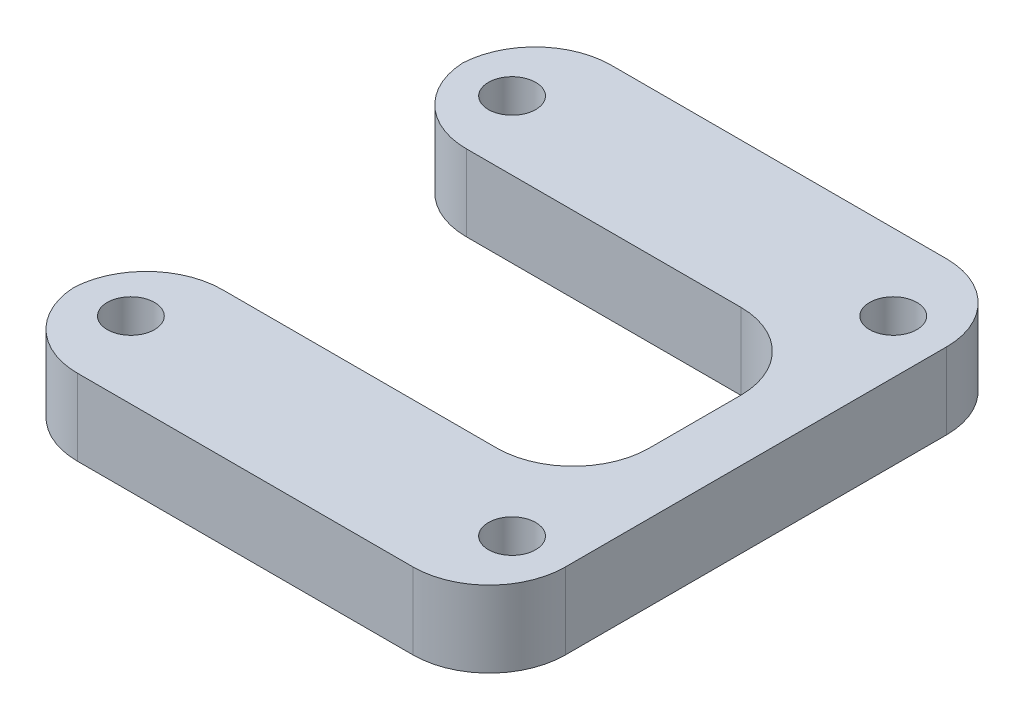
ISO-10303-21;
HEADER;
FILE_DESCRIPTION(('STEP AP214'),'2;1');
FILE_NAME('part.step','',(''),(''),'','','');
FILE_SCHEMA(('AUTOMOTIVE_DESIGN { 1 0 10303 214 1 1 1 1 }'));
ENDSEC;
DATA;
#1=APPLICATION_CONTEXT('core data for automotive mechanical design processes');
#2=APPLICATION_PROTOCOL_DEFINITION('international standard','automotive_design',2000,#1);
#3=PRODUCT_CONTEXT('',#1,'mechanical');
#4=PRODUCT('Part','Part','',(#3));
#5=PRODUCT_RELATED_PRODUCT_CATEGORY('part','',(#4));
#6=PRODUCT_DEFINITION_FORMATION('','',#4);
#7=PRODUCT_DEFINITION_CONTEXT('part definition',#1,'design');
#8=PRODUCT_DEFINITION('design','',#6,#7);
#9=PRODUCT_DEFINITION_SHAPE('','',#8);
#10=(LENGTH_UNIT() NAMED_UNIT(*) SI_UNIT(.MILLI.,.METRE.));
#11=(NAMED_UNIT(*) PLANE_ANGLE_UNIT() SI_UNIT($,.RADIAN.));
#12=(NAMED_UNIT(*) SI_UNIT($,.STERADIAN.) SOLID_ANGLE_UNIT());
#13=UNCERTAINTY_MEASURE_WITH_UNIT(LENGTH_MEASURE(1.E-05),#10,'distance_accuracy_value','');
#14=(GEOMETRIC_REPRESENTATION_CONTEXT(3) GLOBAL_UNCERTAINTY_ASSIGNED_CONTEXT((#13)) GLOBAL_UNIT_ASSIGNED_CONTEXT((#10,
#11,#12)) REPRESENTATION_CONTEXT('',''));
#15=CARTESIAN_POINT('',(0.,0.,0.));
#16=DIRECTION('',(0.,0.,1.));
#17=DIRECTION('',(1.,0.,0.));
#18=AXIS2_PLACEMENT_3D('',#15,#16,#17);
#19=CARTESIAN_POINT('',(0.,5.,-8.));
#20=DIRECTION('',(0.,0.,1.));
#21=DIRECTION('',(1.,0.,0.));
#22=AXIS2_PLACEMENT_3D('',#19,#20,#21);
#23=PLANE('',#22);
#24=DIRECTION('',(-1.,0.,0.));
#25=VECTOR('',#24,1.);
#26=CARTESIAN_POINT('',(0.,0.,-8.));
#27=LINE('',#26,#25);
#28=CARTESIAN_POINT('',(7.,0.,-8.00000000000001));
#29=VERTEX_POINT('',#28);
#30=CARTESIAN_POINT('',(-11.,0.,-8.));
#31=VERTEX_POINT('',#30);
#32=EDGE_CURVE('E145',#29,#31,#27,.T.);
#33=ORIENTED_EDGE('',*,*,#32,.F.);
#34=DIRECTION('',(0.,-1.,0.));
#35=VECTOR('',#34,1.);
#36=CARTESIAN_POINT('',(7.,5.,-8.));
#37=LINE('',#36,#35);
#38=CARTESIAN_POINT('',(7.,5.,-8.00000000000001));
#39=VERTEX_POINT('',#38);
#40=EDGE_CURVE('E158',#29,#39,#37,.F.);
#41=ORIENTED_EDGE('',*,*,#40,.T.);
#42=DIRECTION('',(-1.,0.,0.));
#43=VECTOR('',#42,1.);
#44=CARTESIAN_POINT('',(0.,5.,-8.));
#45=LINE('',#44,#43);
#46=CARTESIAN_POINT('',(-11.,5.,-8.));
#47=VERTEX_POINT('',#46);
#48=EDGE_CURVE('E255',#39,#47,#45,.T.);
#49=ORIENTED_EDGE('',*,*,#48,.T.);
#50=DIRECTION('',(0.,-1.,0.));
#51=VECTOR('',#50,1.);
#52=CARTESIAN_POINT('',(-11.,0.,-8.));
#53=LINE('',#52,#51);
#54=EDGE_CURVE('E161',#47,#31,#53,.T.);
#55=ORIENTED_EDGE('',*,*,#54,.T.);
#56=EDGE_LOOP('',(#33,#41,#49,#55));
#57=FACE_BOUND('',#56,.T.);
#58=ADVANCED_FACE('F41',(#57),#23,.T.);
#59=CARTESIAN_POINT('',(12.,5.,0.));
#60=DIRECTION('',(-1.,0.,0.));
#61=DIRECTION('',(0.,0.,1.));
#62=AXIS2_PLACEMENT_3D('',#59,#60,#61);
#63=PLANE('',#62);
#64=DIRECTION('',(0.,0.,-1.));
#65=VECTOR('',#64,1.);
#66=CARTESIAN_POINT('',(12.,0.,0.));
#67=LINE('',#66,#65);
#68=CARTESIAN_POINT('',(12.,0.,3.));
#69=VERTEX_POINT('',#68);
#70=CARTESIAN_POINT('',(12.,0.,-3.));
#71=VERTEX_POINT('',#70);
#72=EDGE_CURVE('E148',#69,#71,#67,.T.);
#73=ORIENTED_EDGE('',*,*,#72,.F.);
#74=DIRECTION('',(0.,-1.,0.));
#75=VECTOR('',#74,1.);
#76=CARTESIAN_POINT('',(12.,5.,3.));
#77=LINE('',#76,#75);
#78=CARTESIAN_POINT('',(12.,5.,3.));
#79=VERTEX_POINT('',#78);
#80=EDGE_CURVE('E173',#69,#79,#77,.F.);
#81=ORIENTED_EDGE('',*,*,#80,.T.);
#82=DIRECTION('',(0.,0.,-1.));
#83=VECTOR('',#82,1.);
#84=CARTESIAN_POINT('',(12.,5.,0.));
#85=LINE('',#84,#83);
#86=CARTESIAN_POINT('',(12.,5.,-3.));
#87=VERTEX_POINT('',#86);
#88=EDGE_CURVE('E248',#79,#87,#85,.T.);
#89=ORIENTED_EDGE('',*,*,#88,.T.);
#90=DIRECTION('',(0.,-1.,0.));
#91=VECTOR('',#90,1.);
#92=CARTESIAN_POINT('',(12.,0.,-3.));
#93=LINE('',#92,#91);
#94=EDGE_CURVE('E240',#87,#71,#93,.T.);
#95=ORIENTED_EDGE('',*,*,#94,.T.);
#96=EDGE_LOOP('',(#73,#81,#89,#95));
#97=FACE_BOUND('',#96,.T.);
#98=ADVANCED_FACE('F247',(#97),#63,.T.);
#99=CARTESIAN_POINT('',(0.,5.,8.));
#100=DIRECTION('',(0.,0.,-1.));
#101=DIRECTION('',(-1.,0.,0.));
#102=AXIS2_PLACEMENT_3D('',#99,#100,#101);
#103=PLANE('',#102);
#104=DIRECTION('',(1.,0.,0.));
#105=VECTOR('',#104,1.);
#106=CARTESIAN_POINT('',(0.,0.,8.));
#107=LINE('',#106,#105);
#108=CARTESIAN_POINT('',(-11.,0.,8.));
#109=VERTEX_POINT('',#108);
#110=CARTESIAN_POINT('',(7.,0.,8.));
#111=VERTEX_POINT('',#110);
#112=EDGE_CURVE('E299',#109,#111,#107,.T.);
#113=ORIENTED_EDGE('',*,*,#112,.F.);
#114=DIRECTION('',(0.,-1.,0.));
#115=VECTOR('',#114,1.);
#116=CARTESIAN_POINT('',(-11.,5.,8.));
#117=LINE('',#116,#115);
#118=CARTESIAN_POINT('',(-11.,5.,8.));
#119=VERTEX_POINT('',#118);
#120=EDGE_CURVE('E209',#109,#119,#117,.F.);
#121=ORIENTED_EDGE('',*,*,#120,.T.);
#122=DIRECTION('',(1.,0.,0.));
#123=VECTOR('',#122,1.);
#124=CARTESIAN_POINT('',(0.,5.,8.));
#125=LINE('',#124,#123);
#126=CARTESIAN_POINT('',(7.,5.,8.));
#127=VERTEX_POINT('',#126);
#128=EDGE_CURVE('E254',#119,#127,#125,.T.);
#129=ORIENTED_EDGE('',*,*,#128,.T.);
#130=DIRECTION('',(0.,-1.,0.));
#131=VECTOR('',#130,1.);
#132=CARTESIAN_POINT('',(7.,0.,8.));
#133=LINE('',#132,#131);
#134=EDGE_CURVE('E260',#127,#111,#133,.T.);
#135=ORIENTED_EDGE('',*,*,#134,.T.);
#136=EDGE_LOOP('',(#113,#121,#129,#135));
#137=FACE_BOUND('',#136,.T.);
#138=ADVANCED_FACE('F381',(#137),#103,.T.);
#139=CARTESIAN_POINT('',(0.,5.,17.5));
#140=DIRECTION('',(0.,0.,1.));
#141=DIRECTION('',(1.,0.,0.));
#142=AXIS2_PLACEMENT_3D('',#139,#140,#141);
#143=PLANE('',#142);
#144=DIRECTION('',(-1.,0.,0.));
#145=VECTOR('',#144,1.);
#146=CARTESIAN_POINT('',(0.,5.,17.5));
#147=LINE('',#146,#145);
#148=CARTESIAN_POINT('',(11.,5.,17.5));
#149=VERTEX_POINT('',#148);
#150=CARTESIAN_POINT('',(-11.,5.,17.5));
#151=VERTEX_POINT('',#150);
#152=EDGE_CURVE('E320',#149,#151,#147,.T.);
#153=ORIENTED_EDGE('',*,*,#152,.T.);
#154=DIRECTION('',(0.,-1.,0.));
#155=VECTOR('',#154,1.);
#156=CARTESIAN_POINT('',(-11.,0.,17.5));
#157=LINE('',#156,#155);
#158=CARTESIAN_POINT('',(-11.,0.,17.5));
#159=VERTEX_POINT('',#158);
#160=EDGE_CURVE('E223',#151,#159,#157,.T.);
#161=ORIENTED_EDGE('',*,*,#160,.T.);
#162=DIRECTION('',(-1.,0.,0.));
#163=VECTOR('',#162,1.);
#164=CARTESIAN_POINT('',(0.,0.,17.5));
#165=LINE('',#164,#163);
#166=CARTESIAN_POINT('',(11.,0.,17.5));
#167=VERTEX_POINT('',#166);
#168=EDGE_CURVE('E295',#167,#159,#165,.T.);
#169=ORIENTED_EDGE('',*,*,#168,.F.);
#170=DIRECTION('',(0.,-1.,0.));
#171=VECTOR('',#170,1.);
#172=CARTESIAN_POINT('',(11.,5.,17.5));
#173=LINE('',#172,#171);
#174=EDGE_CURVE('E220',#167,#149,#173,.F.);
#175=ORIENTED_EDGE('',*,*,#174,.T.);
#176=EDGE_LOOP('',(#153,#161,#169,#175));
#177=FACE_BOUND('',#176,.T.);
#178=ADVANCED_FACE('F429',(#177),#143,.T.);
#179=CARTESIAN_POINT('',(16.,5.,0.));
#180=DIRECTION('',(1.,0.,0.));
#181=DIRECTION('',(0.,0.,-1.));
#182=AXIS2_PLACEMENT_3D('',#179,#180,#181);
#183=PLANE('',#182);
#184=DIRECTION('',(0.,0.,1.));
#185=VECTOR('',#184,1.);
#186=CARTESIAN_POINT('',(16.,0.,0.));
#187=LINE('',#186,#185);
#188=CARTESIAN_POINT('',(16.,0.,-12.5));
#189=VERTEX_POINT('',#188);
#190=CARTESIAN_POINT('',(16.,0.,12.5));
#191=VERTEX_POINT('',#190);
#192=EDGE_CURVE('E291',#189,#191,#187,.T.);
#193=ORIENTED_EDGE('',*,*,#192,.F.);
#194=DIRECTION('',(0.,-1.,0.));
#195=VECTOR('',#194,1.);
#196=CARTESIAN_POINT('',(16.,5.,-12.5));
#197=LINE('',#196,#195);
#198=CARTESIAN_POINT('',(16.,5.,-12.5));
#199=VERTEX_POINT('',#198);
#200=EDGE_CURVE('E237',#189,#199,#197,.F.);
#201=ORIENTED_EDGE('',*,*,#200,.T.);
#202=DIRECTION('',(0.,0.,1.));
#203=VECTOR('',#202,1.);
#204=CARTESIAN_POINT('',(16.,5.,0.));
#205=LINE('',#204,#203);
#206=CARTESIAN_POINT('',(16.,5.,12.5));
#207=VERTEX_POINT('',#206);
#208=EDGE_CURVE('E316',#199,#207,#205,.T.);
#209=ORIENTED_EDGE('',*,*,#208,.T.);
#210=DIRECTION('',(0.,-1.,0.));
#211=VECTOR('',#210,1.);
#212=CARTESIAN_POINT('',(16.,5.,12.5));
#213=LINE('',#212,#211);
#214=EDGE_CURVE('E233',#207,#191,#213,.T.);
#215=ORIENTED_EDGE('',*,*,#214,.T.);
#216=EDGE_LOOP('',(#193,#201,#209,#215));
#217=FACE_BOUND('',#216,.T.);
#218=ADVANCED_FACE('F420',(#217),#183,.T.);
#219=CARTESIAN_POINT('',(0.,5.,-17.5));
#220=DIRECTION('',(0.,0.,1.));
#221=DIRECTION('',(1.,0.,0.));
#222=AXIS2_PLACEMENT_3D('',#219,#220,#221);
#223=PLANE('',#222);
#224=DIRECTION('',(-1.,0.,0.));
#225=VECTOR('',#224,1.);
#226=CARTESIAN_POINT('',(0.,0.,-17.5));
#227=LINE('',#226,#225);
#228=CARTESIAN_POINT('',(11.,0.,-17.5));
#229=VERTEX_POINT('',#228);
#230=CARTESIAN_POINT('',(-11.,0.,-17.5));
#231=VERTEX_POINT('',#230);
#232=EDGE_CURVE('E286',#229,#231,#227,.T.);
#233=ORIENTED_EDGE('',*,*,#232,.T.);
#234=DIRECTION('',(0.,-1.,0.));
#235=VECTOR('',#234,1.);
#236=CARTESIAN_POINT('',(-11.,5.,-17.5));
#237=LINE('',#236,#235);
#238=CARTESIAN_POINT('',(-11.,5.,-17.5));
#239=VERTEX_POINT('',#238);
#240=EDGE_CURVE('E230',#231,#239,#237,.F.);
#241=ORIENTED_EDGE('',*,*,#240,.T.);
#242=DIRECTION('',(-1.,0.,0.));
#243=VECTOR('',#242,1.);
#244=CARTESIAN_POINT('',(0.,5.,-17.5));
#245=LINE('',#244,#243);
#246=CARTESIAN_POINT('',(11.,5.,-17.5));
#247=VERTEX_POINT('',#246);
#248=EDGE_CURVE('E285',#247,#239,#245,.T.);
#249=ORIENTED_EDGE('',*,*,#248,.F.);
#250=DIRECTION('',(0.,-1.,0.));
#251=VECTOR('',#250,1.);
#252=CARTESIAN_POINT('',(11.,0.,-17.5));
#253=LINE('',#252,#251);
#254=EDGE_CURVE('E226',#247,#229,#253,.T.);
#255=ORIENTED_EDGE('',*,*,#254,.T.);
#256=EDGE_LOOP('',(#233,#241,#249,#255));
#257=FACE_BOUND('',#256,.T.);
#258=ADVANCED_FACE('F360',(#257),#223,.F.);
#259=CARTESIAN_POINT('',(-12.5,5.,12.5));
#260=DIRECTION('',(0.,-1.,0.));
#261=DIRECTION('',(0.,0.,-1.));
#262=AXIS2_PLACEMENT_3D('',#259,#260,#261);
#263=CYLINDRICAL_SURFACE('',#262,1.55);
#264=CARTESIAN_POINT('',(-12.5,5.,12.5));
#265=DIRECTION('',(0.,1.,0.));
#266=DIRECTION('',(0.,0.,1.));
#267=AXIS2_PLACEMENT_3D('',#264,#265,#266);
#268=CIRCLE('',#267,1.55);
#269=CARTESIAN_POINT('',(-12.5,5.,14.05));
#270=VERTEX_POINT('',#269);
#271=EDGE_CURVE('E328',#270,#270,#268,.T.);
#272=ORIENTED_EDGE('',*,*,#271,.T.);
#273=EDGE_LOOP('',(#272));
#274=FACE_BOUND('',#273,.T.);
#275=CARTESIAN_POINT('',(-12.5,0.,12.5));
#276=DIRECTION('',(0.,1.,0.));
#277=DIRECTION('',(0.,0.,1.));
#278=AXIS2_PLACEMENT_3D('',#275,#276,#277);
#279=CIRCLE('',#278,1.55);
#280=CARTESIAN_POINT('',(-12.5,0.,14.05));
#281=VERTEX_POINT('',#280);
#282=EDGE_CURVE('E163',#281,#281,#279,.T.);
#283=ORIENTED_EDGE('',*,*,#282,.F.);
#284=EDGE_LOOP('',(#283));
#285=FACE_BOUND('',#284,.T.);
#286=ADVANCED_FACE('F356',(#274,#285),#263,.F.);
#287=CARTESIAN_POINT('',(12.5,5.,12.5));
#288=DIRECTION('',(0.,-1.,0.));
#289=DIRECTION('',(0.,0.,-1.));
#290=AXIS2_PLACEMENT_3D('',#287,#288,#289);
#291=CYLINDRICAL_SURFACE('',#290,1.55);
#292=CARTESIAN_POINT('',(12.5,5.,12.5));
#293=DIRECTION('',(0.,1.,0.));
#294=DIRECTION('',(0.,0.,1.));
#295=AXIS2_PLACEMENT_3D('',#292,#293,#294);
#296=CIRCLE('',#295,1.55);
#297=CARTESIAN_POINT('',(12.5,5.,14.05));
#298=VERTEX_POINT('',#297);
#299=EDGE_CURVE('E332',#298,#298,#296,.T.);
#300=ORIENTED_EDGE('',*,*,#299,.T.);
#301=EDGE_LOOP('',(#300));
#302=FACE_BOUND('',#301,.T.);
#303=CARTESIAN_POINT('',(12.5,0.,12.5));
#304=DIRECTION('',(0.,1.,0.));
#305=DIRECTION('',(0.,0.,1.));
#306=AXIS2_PLACEMENT_3D('',#303,#304,#305);
#307=CIRCLE('',#306,1.55);
#308=CARTESIAN_POINT('',(12.5,0.,14.05));
#309=VERTEX_POINT('',#308);
#310=EDGE_CURVE('E307',#309,#309,#307,.T.);
#311=ORIENTED_EDGE('',*,*,#310,.F.);
#312=EDGE_LOOP('',(#311));
#313=FACE_BOUND('',#312,.T.);
#314=ADVANCED_FACE('F359',(#302,#313),#291,.F.);
#315=CARTESIAN_POINT('',(12.5,5.,-12.5));
#316=DIRECTION('',(0.,-1.,0.));
#317=DIRECTION('',(0.,0.,-1.));
#318=AXIS2_PLACEMENT_3D('',#315,#316,#317);
#319=CYLINDRICAL_SURFACE('',#318,1.55);
#320=CARTESIAN_POINT('',(12.5,5.,-12.5));
#321=DIRECTION('',(0.,1.,0.));
#322=DIRECTION('',(0.,0.,1.));
#323=AXIS2_PLACEMENT_3D('',#320,#321,#322);
#324=CIRCLE('',#323,1.55);
#325=CARTESIAN_POINT('',(12.5,5.,-10.95));
#326=VERTEX_POINT('',#325);
#327=EDGE_CURVE('E336',#326,#326,#324,.T.);
#328=ORIENTED_EDGE('',*,*,#327,.T.);
#329=EDGE_LOOP('',(#328));
#330=FACE_BOUND('',#329,.T.);
#331=CARTESIAN_POINT('',(12.5,0.,-12.5));
#332=DIRECTION('',(0.,1.,0.));
#333=DIRECTION('',(0.,0.,1.));
#334=AXIS2_PLACEMENT_3D('',#331,#332,#333);
#335=CIRCLE('',#334,1.55);
#336=CARTESIAN_POINT('',(12.5,0.,-10.95));
#337=VERTEX_POINT('',#336);
#338=EDGE_CURVE('E188',#337,#337,#335,.T.);
#339=ORIENTED_EDGE('',*,*,#338,.F.);
#340=EDGE_LOOP('',(#339));
#341=FACE_BOUND('',#340,.T.);
#342=ADVANCED_FACE('F387',(#330,#341),#319,.F.);
#343=CARTESIAN_POINT('',(-12.5,5.,-12.5));
#344=DIRECTION('',(0.,-1.,0.));
#345=DIRECTION('',(0.,0.,-1.));
#346=AXIS2_PLACEMENT_3D('',#343,#344,#345);
#347=CYLINDRICAL_SURFACE('',#346,1.55);
#348=CARTESIAN_POINT('',(-12.5,5.,-12.5));
#349=DIRECTION('',(0.,1.,0.));
#350=DIRECTION('',(0.,0.,1.));
#351=AXIS2_PLACEMENT_3D('',#348,#349,#350);
#352=CIRCLE('',#351,1.55);
#353=CARTESIAN_POINT('',(-12.5,5.,-10.95));
#354=VERTEX_POINT('',#353);
#355=EDGE_CURVE('E290',#354,#354,#352,.T.);
#356=ORIENTED_EDGE('',*,*,#355,.T.);
#357=EDGE_LOOP('',(#356));
#358=FACE_BOUND('',#357,.T.);
#359=CARTESIAN_POINT('',(-12.5,0.,-12.5));
#360=DIRECTION('',(0.,1.,0.));
#361=DIRECTION('',(0.,0.,1.));
#362=AXIS2_PLACEMENT_3D('',#359,#360,#361);
#363=CIRCLE('',#362,1.55);
#364=CARTESIAN_POINT('',(-12.5,0.,-10.95));
#365=VERTEX_POINT('',#364);
#366=EDGE_CURVE('E181',#365,#365,#363,.T.);
#367=ORIENTED_EDGE('',*,*,#366,.F.);
#368=EDGE_LOOP('',(#367));
#369=FACE_BOUND('',#368,.T.);
#370=ADVANCED_FACE('F344',(#358,#369),#347,.F.);
#371=CARTESIAN_POINT('',(0.,5.,0.));
#372=DIRECTION('',(0.,1.,0.));
#373=DIRECTION('',(0.,0.,1.));
#374=AXIS2_PLACEMENT_3D('',#371,#372,#373);
#375=PLANE('',#374);
#376=ORIENTED_EDGE('',*,*,#355,.F.);
#377=EDGE_LOOP('',(#376));
#378=FACE_BOUND('',#377,.T.);
#379=ORIENTED_EDGE('',*,*,#327,.F.);
#380=EDGE_LOOP('',(#379));
#381=FACE_BOUND('',#380,.T.);
#382=ORIENTED_EDGE('',*,*,#299,.F.);
#383=EDGE_LOOP('',(#382));
#384=FACE_BOUND('',#383,.T.);
#385=ORIENTED_EDGE('',*,*,#271,.F.);
#386=EDGE_LOOP('',(#385));
#387=FACE_BOUND('',#386,.T.);
#388=ORIENTED_EDGE('',*,*,#128,.F.);
#389=CARTESIAN_POINT('',(-11.,5.,13.));
#390=DIRECTION('',(0.,1.,0.));
#391=DIRECTION('',(0.,0.,1.));
#392=AXIS2_PLACEMENT_3D('',#389,#390,#391);
#393=CIRCLE('',#392,5.);
#394=CARTESIAN_POINT('',(-15.9937460888595,5.,12.75));
#395=VERTEX_POINT('',#394);
#396=EDGE_CURVE('E59',#119,#395,#393,.T.);
#397=ORIENTED_EDGE('',*,*,#396,.T.);
#398=CARTESIAN_POINT('',(-11.,5.,12.5));
#399=DIRECTION('',(0.,1.,0.));
#400=DIRECTION('',(0.,0.,1.));
#401=AXIS2_PLACEMENT_3D('',#398,#399,#400);
#402=CIRCLE('',#401,5.);
#403=EDGE_CURVE('E215',#395,#151,#402,.T.);
#404=ORIENTED_EDGE('',*,*,#403,.T.);
#405=ORIENTED_EDGE('',*,*,#152,.F.);
#406=CARTESIAN_POINT('',(11.,5.,12.5));
#407=DIRECTION('',(0.,1.,0.));
#408=DIRECTION('',(0.,0.,1.));
#409=AXIS2_PLACEMENT_3D('',#406,#407,#408);
#410=CIRCLE('',#409,5.);
#411=EDGE_CURVE('E203',#149,#207,#410,.T.);
#412=ORIENTED_EDGE('',*,*,#411,.T.);
#413=ORIENTED_EDGE('',*,*,#208,.F.);
#414=CARTESIAN_POINT('',(11.,5.,-12.5));
#415=DIRECTION('',(0.,1.,0.));
#416=DIRECTION('',(0.,0.,1.));
#417=AXIS2_PLACEMENT_3D('',#414,#415,#416);
#418=CIRCLE('',#417,5.);
#419=EDGE_CURVE('E207',#199,#247,#418,.T.);
#420=ORIENTED_EDGE('',*,*,#419,.T.);
#421=ORIENTED_EDGE('',*,*,#248,.T.);
#422=CARTESIAN_POINT('',(-11.,5.,-12.5));
#423=DIRECTION('',(0.,1.,0.));
#424=DIRECTION('',(0.,0.,1.));
#425=AXIS2_PLACEMENT_3D('',#422,#423,#424);
#426=CIRCLE('',#425,5.);
#427=CARTESIAN_POINT('',(-15.9937460888595,5.,-12.75));
#428=VERTEX_POINT('',#427);
#429=EDGE_CURVE('E66',#239,#428,#426,.T.);
#430=ORIENTED_EDGE('',*,*,#429,.T.);
#431=CARTESIAN_POINT('',(-11.,5.,-13.));
#432=DIRECTION('',(0.,1.,0.));
#433=DIRECTION('',(0.,0.,1.));
#434=AXIS2_PLACEMENT_3D('',#431,#432,#433);
#435=CIRCLE('',#434,5.);
#436=EDGE_CURVE('E201',#428,#47,#435,.T.);
#437=ORIENTED_EDGE('',*,*,#436,.T.);
#438=ORIENTED_EDGE('',*,*,#48,.F.);
#439=CARTESIAN_POINT('',(7.,5.,-3.));
#440=DIRECTION('',(0.,1.,0.));
#441=DIRECTION('',(0.,0.,1.));
#442=AXIS2_PLACEMENT_3D('',#439,#440,#441);
#443=CIRCLE('',#442,5.);
#444=EDGE_CURVE('E11',#39,#87,#443,.F.);
#445=ORIENTED_EDGE('',*,*,#444,.T.);
#446=ORIENTED_EDGE('',*,*,#88,.F.);
#447=CARTESIAN_POINT('',(7.,5.,3.));
#448=DIRECTION('',(0.,1.,0.));
#449=DIRECTION('',(0.,0.,1.));
#450=AXIS2_PLACEMENT_3D('',#447,#448,#449);
#451=CIRCLE('',#450,5.);
#452=EDGE_CURVE('E154',#79,#127,#451,.F.);
#453=ORIENTED_EDGE('',*,*,#452,.T.);
#454=EDGE_LOOP('',(#388,#397,#404,#405,#412,#413,#420,#421,#430,#437,#438,#445,#446,#453));
#455=FACE_BOUND('',#454,.T.);
#456=ADVANCED_FACE('F251',(#378,#381,#384,#387,#455),#375,.T.);
#457=CARTESIAN_POINT('',(0.,0.,0.));
#458=DIRECTION('',(0.,1.,0.));
#459=DIRECTION('',(0.,0.,1.));
#460=AXIS2_PLACEMENT_3D('',#457,#458,#459);
#461=PLANE('',#460);
#462=ORIENTED_EDGE('',*,*,#366,.T.);
#463=EDGE_LOOP('',(#462));
#464=FACE_BOUND('',#463,.T.);
#465=ORIENTED_EDGE('',*,*,#338,.T.);
#466=EDGE_LOOP('',(#465));
#467=FACE_BOUND('',#466,.T.);
#468=ORIENTED_EDGE('',*,*,#310,.T.);
#469=EDGE_LOOP('',(#468));
#470=FACE_BOUND('',#469,.T.);
#471=ORIENTED_EDGE('',*,*,#282,.T.);
#472=EDGE_LOOP('',(#471));
#473=FACE_BOUND('',#472,.T.);
#474=CARTESIAN_POINT('',(-11.,0.,12.5));
#475=DIRECTION('',(0.,1.,0.));
#476=DIRECTION('',(0.,0.,1.));
#477=AXIS2_PLACEMENT_3D('',#474,#475,#476);
#478=CIRCLE('',#477,5.);
#479=CARTESIAN_POINT('',(-15.9937460888595,0.,12.75));
#480=VERTEX_POINT('',#479);
#481=EDGE_CURVE('E270',#159,#480,#478,.F.);
#482=ORIENTED_EDGE('',*,*,#481,.T.);
#483=CARTESIAN_POINT('',(-11.,0.,13.));
#484=DIRECTION('',(0.,1.,0.));
#485=DIRECTION('',(0.,0.,1.));
#486=AXIS2_PLACEMENT_3D('',#483,#484,#485);
#487=CIRCLE('',#486,5.);
#488=EDGE_CURVE('E265',#480,#109,#487,.F.);
#489=ORIENTED_EDGE('',*,*,#488,.T.);
#490=ORIENTED_EDGE('',*,*,#112,.T.);
#491=CARTESIAN_POINT('',(7.,0.,3.));
#492=DIRECTION('',(0.,1.,0.));
#493=DIRECTION('',(0.,0.,1.));
#494=AXIS2_PLACEMENT_3D('',#491,#492,#493);
#495=CIRCLE('',#494,5.);
#496=EDGE_CURVE('E168',#111,#69,#495,.T.);
#497=ORIENTED_EDGE('',*,*,#496,.T.);
#498=ORIENTED_EDGE('',*,*,#72,.T.);
#499=CARTESIAN_POINT('',(7.,0.,-3.));
#500=DIRECTION('',(0.,1.,0.));
#501=DIRECTION('',(0.,0.,1.));
#502=AXIS2_PLACEMENT_3D('',#499,#500,#501);
#503=CIRCLE('',#502,5.);
#504=EDGE_CURVE('E51',#71,#29,#503,.T.);
#505=ORIENTED_EDGE('',*,*,#504,.T.);
#506=ORIENTED_EDGE('',*,*,#32,.T.);
#507=CARTESIAN_POINT('',(-11.,0.,-13.));
#508=DIRECTION('',(0.,1.,0.));
#509=DIRECTION('',(0.,0.,1.));
#510=AXIS2_PLACEMENT_3D('',#507,#508,#509);
#511=CIRCLE('',#510,5.);
#512=CARTESIAN_POINT('',(-15.9937460888595,0.,-12.75));
#513=VERTEX_POINT('',#512);
#514=EDGE_CURVE('E200',#31,#513,#511,.F.);
#515=ORIENTED_EDGE('',*,*,#514,.T.);
#516=CARTESIAN_POINT('',(-11.,0.,-12.5));
#517=DIRECTION('',(0.,1.,0.));
#518=DIRECTION('',(0.,0.,1.));
#519=AXIS2_PLACEMENT_3D('',#516,#517,#518);
#520=CIRCLE('',#519,5.);
#521=EDGE_CURVE('E197',#513,#231,#520,.F.);
#522=ORIENTED_EDGE('',*,*,#521,.T.);
#523=ORIENTED_EDGE('',*,*,#232,.F.);
#524=CARTESIAN_POINT('',(11.,0.,-12.5));
#525=DIRECTION('',(0.,1.,0.));
#526=DIRECTION('',(0.,0.,1.));
#527=AXIS2_PLACEMENT_3D('',#524,#525,#526);
#528=CIRCLE('',#527,5.);
#529=EDGE_CURVE('E275',#229,#189,#528,.F.);
#530=ORIENTED_EDGE('',*,*,#529,.T.);
#531=ORIENTED_EDGE('',*,*,#192,.T.);
#532=CARTESIAN_POINT('',(11.,0.,12.5));
#533=DIRECTION('',(0.,1.,0.));
#534=DIRECTION('',(0.,0.,1.));
#535=AXIS2_PLACEMENT_3D('',#532,#533,#534);
#536=CIRCLE('',#535,5.);
#537=EDGE_CURVE('E282',#191,#167,#536,.F.);
#538=ORIENTED_EDGE('',*,*,#537,.T.);
#539=ORIENTED_EDGE('',*,*,#168,.T.);
#540=EDGE_LOOP('',(#482,#489,#490,#497,#498,#505,#506,#515,#522,#523,#530,#531,#538,#539));
#541=FACE_BOUND('',#540,.T.);
#542=ADVANCED_FACE('F144',(#464,#467,#470,#473,#541),#461,.F.);
#543=CARTESIAN_POINT('',(-11.,5.,12.5));
#544=DIRECTION('',(0.,1.,0.));
#545=DIRECTION('',(0.,0.,1.));
#546=AXIS2_PLACEMENT_3D('',#543,#544,#545);
#547=CYLINDRICAL_SURFACE('',#546,5.);
#548=ORIENTED_EDGE('',*,*,#160,.F.);
#549=ORIENTED_EDGE('',*,*,#403,.F.);
#550=DIRECTION('',(0.,1.,0.));
#551=VECTOR('',#550,1.);
#552=CARTESIAN_POINT('',(-15.9937460888595,2.5,12.75));
#553=LINE('',#552,#551);
#554=EDGE_CURVE('E178',#480,#395,#553,.T.);
#555=ORIENTED_EDGE('',*,*,#554,.F.);
#556=ORIENTED_EDGE('',*,*,#481,.F.);
#557=EDGE_LOOP('',(#548,#549,#555,#556));
#558=FACE_BOUND('',#557,.T.);
#559=ADVANCED_FACE('F365',(#558),#547,.T.);
#560=CARTESIAN_POINT('',(-11.,5.,13.));
#561=DIRECTION('',(0.,1.,0.));
#562=DIRECTION('',(0.,0.,1.));
#563=AXIS2_PLACEMENT_3D('',#560,#561,#562);
#564=CYLINDRICAL_SURFACE('',#563,5.);
#565=ORIENTED_EDGE('',*,*,#396,.F.);
#566=ORIENTED_EDGE('',*,*,#120,.F.);
#567=ORIENTED_EDGE('',*,*,#488,.F.);
#568=ORIENTED_EDGE('',*,*,#554,.T.);
#569=EDGE_LOOP('',(#565,#566,#567,#568));
#570=FACE_BOUND('',#569,.T.);
#571=ADVANCED_FACE('F371',(#570),#564,.T.);
#572=CARTESIAN_POINT('',(-11.,5.,-13.));
#573=DIRECTION('',(0.,1.,0.));
#574=DIRECTION('',(0.,0.,1.));
#575=AXIS2_PLACEMENT_3D('',#572,#573,#574);
#576=CYLINDRICAL_SURFACE('',#575,5.);
#577=ORIENTED_EDGE('',*,*,#54,.F.);
#578=ORIENTED_EDGE('',*,*,#436,.F.);
#579=DIRECTION('',(0.,1.,0.));
#580=VECTOR('',#579,1.);
#581=CARTESIAN_POINT('',(-15.9937460888595,2.5,-12.75));
#582=LINE('',#581,#580);
#583=EDGE_CURVE('E45',#513,#428,#582,.T.);
#584=ORIENTED_EDGE('',*,*,#583,.F.);
#585=ORIENTED_EDGE('',*,*,#514,.F.);
#586=EDGE_LOOP('',(#577,#578,#584,#585));
#587=FACE_BOUND('',#586,.T.);
#588=ADVANCED_FACE('F199',(#587),#576,.T.);
#589=CARTESIAN_POINT('',(-11.,5.,-12.5));
#590=DIRECTION('',(0.,-1.,0.));
#591=DIRECTION('',(0.,0.,-1.));
#592=AXIS2_PLACEMENT_3D('',#589,#590,#591);
#593=CYLINDRICAL_SURFACE('',#592,5.);
#594=ORIENTED_EDGE('',*,*,#429,.F.);
#595=ORIENTED_EDGE('',*,*,#240,.F.);
#596=ORIENTED_EDGE('',*,*,#521,.F.);
#597=ORIENTED_EDGE('',*,*,#583,.T.);
#598=EDGE_LOOP('',(#594,#595,#596,#597));
#599=FACE_BOUND('',#598,.T.);
#600=ADVANCED_FACE('F194',(#599),#593,.T.);
#601=CARTESIAN_POINT('',(11.,5.,-12.5));
#602=DIRECTION('',(0.,1.,0.));
#603=DIRECTION('',(0.,0.,1.));
#604=AXIS2_PLACEMENT_3D('',#601,#602,#603);
#605=CYLINDRICAL_SURFACE('',#604,5.);
#606=ORIENTED_EDGE('',*,*,#419,.F.);
#607=ORIENTED_EDGE('',*,*,#200,.F.);
#608=ORIENTED_EDGE('',*,*,#529,.F.);
#609=ORIENTED_EDGE('',*,*,#254,.F.);
#610=EDGE_LOOP('',(#606,#607,#608,#609));
#611=FACE_BOUND('',#610,.T.);
#612=ADVANCED_FACE('F398',(#611),#605,.T.);
#613=CARTESIAN_POINT('',(7.,5.,3.));
#614=DIRECTION('',(0.,1.,0.));
#615=DIRECTION('',(0.,0.,1.));
#616=AXIS2_PLACEMENT_3D('',#613,#614,#615);
#617=CYLINDRICAL_SURFACE('',#616,5.);
#618=ORIENTED_EDGE('',*,*,#452,.F.);
#619=ORIENTED_EDGE('',*,*,#80,.F.);
#620=ORIENTED_EDGE('',*,*,#496,.F.);
#621=ORIENTED_EDGE('',*,*,#134,.F.);
#622=EDGE_LOOP('',(#618,#619,#620,#621));
#623=FACE_BOUND('',#622,.T.);
#624=ADVANCED_FACE('F258',(#623),#617,.F.);
#625=CARTESIAN_POINT('',(7.,5.,-3.));
#626=DIRECTION('',(0.,1.,0.));
#627=DIRECTION('',(0.,0.,1.));
#628=AXIS2_PLACEMENT_3D('',#625,#626,#627);
#629=CYLINDRICAL_SURFACE('',#628,5.);
#630=ORIENTED_EDGE('',*,*,#444,.F.);
#631=ORIENTED_EDGE('',*,*,#40,.F.);
#632=ORIENTED_EDGE('',*,*,#504,.F.);
#633=ORIENTED_EDGE('',*,*,#94,.F.);
#634=EDGE_LOOP('',(#630,#631,#632,#633));
#635=FACE_BOUND('',#634,.T.);
#636=ADVANCED_FACE('F166',(#635),#629,.F.);
#637=CARTESIAN_POINT('',(11.,5.,12.5));
#638=DIRECTION('',(0.,-1.,0.));
#639=DIRECTION('',(0.,0.,-1.));
#640=AXIS2_PLACEMENT_3D('',#637,#638,#639);
#641=CYLINDRICAL_SURFACE('',#640,5.);
#642=ORIENTED_EDGE('',*,*,#411,.F.);
#643=ORIENTED_EDGE('',*,*,#174,.F.);
#644=ORIENTED_EDGE('',*,*,#537,.F.);
#645=ORIENTED_EDGE('',*,*,#214,.F.);
#646=EDGE_LOOP('',(#642,#643,#644,#645));
#647=FACE_BOUND('',#646,.T.);
#648=ADVANCED_FACE('F43',(#647),#641,.T.);
#649=CLOSED_SHELL('',(#58,#98,#138,#178,#218,#258,#286,#314,#342,#370,#456,#542,#559,#571,#588,
#600,#612,#624,#636,#648));
#650=MANIFOLD_SOLID_BREP('B2',#649);
#651=ADVANCED_BREP_SHAPE_REPRESENTATION('',(#18,#650),#14);
#652=SHAPE_DEFINITION_REPRESENTATION(#9,#651);
ENDSEC;
END-ISO-10303-21;
